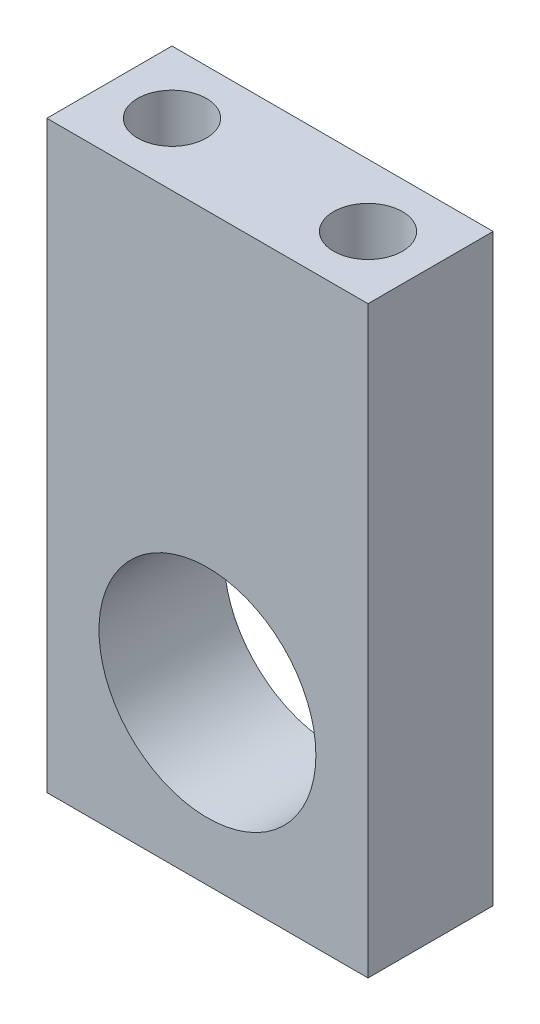
ISO-10303-21;
HEADER;
FILE_DESCRIPTION(('STEP AP214'),'2;1');
FILE_NAME('part.step','',(''),(''),'','','');
FILE_SCHEMA(('AUTOMOTIVE_DESIGN { 1 0 10303 214 1 1 1 1 }'));
ENDSEC;
DATA;
#1=APPLICATION_CONTEXT('core data for automotive mechanical design processes');
#2=APPLICATION_PROTOCOL_DEFINITION('international standard','automotive_design',2000,#1);
#3=PRODUCT_CONTEXT('',#1,'mechanical');
#4=PRODUCT('Part','Part','',(#3));
#5=PRODUCT_RELATED_PRODUCT_CATEGORY('part','',(#4));
#6=PRODUCT_DEFINITION_FORMATION('','',#4);
#7=PRODUCT_DEFINITION_CONTEXT('part definition',#1,'design');
#8=PRODUCT_DEFINITION('design','',#6,#7);
#9=PRODUCT_DEFINITION_SHAPE('','',#8);
#10=(LENGTH_UNIT() NAMED_UNIT(*) SI_UNIT(.MILLI.,.METRE.));
#11=(NAMED_UNIT(*) PLANE_ANGLE_UNIT() SI_UNIT($,.RADIAN.));
#12=(NAMED_UNIT(*) SI_UNIT($,.STERADIAN.) SOLID_ANGLE_UNIT());
#13=UNCERTAINTY_MEASURE_WITH_UNIT(LENGTH_MEASURE(1.E-05),#10,'distance_accuracy_value','');
#14=(GEOMETRIC_REPRESENTATION_CONTEXT(3) GLOBAL_UNCERTAINTY_ASSIGNED_CONTEXT((#13)) GLOBAL_UNIT_ASSIGNED_CONTEXT((#10,
#11,#12)) REPRESENTATION_CONTEXT('',''));
#15=CARTESIAN_POINT('',(0.,0.,0.));
#16=DIRECTION('',(0.,0.,1.));
#17=DIRECTION('',(1.,0.,0.));
#18=AXIS2_PLACEMENT_3D('',#15,#16,#17);
#19=CARTESIAN_POINT('',(7.7,28.,-3.));
#20=DIRECTION('',(-1.,0.,0.));
#21=DIRECTION('',(0.,0.,1.));
#22=AXIS2_PLACEMENT_3D('',#19,#20,#21);
#23=PLANE('',#22);
#24=DIRECTION('',(0.,0.,-1.));
#25=VECTOR('',#24,1.);
#26=CARTESIAN_POINT('',(7.7,0.,-3.));
#27=LINE('',#26,#25);
#28=CARTESIAN_POINT('',(7.7,0.,3.));
#29=VERTEX_POINT('',#28);
#30=CARTESIAN_POINT('',(7.7,0.,-3.));
#31=VERTEX_POINT('',#30);
#32=EDGE_CURVE('E131',#29,#31,#27,.T.);
#33=ORIENTED_EDGE('',*,*,#32,.T.);
#34=DIRECTION('',(0.,-1.,0.));
#35=VECTOR('',#34,1.);
#36=CARTESIAN_POINT('',(7.7,28.,-3.));
#37=LINE('',#36,#35);
#38=CARTESIAN_POINT('',(7.7,28.,-3.));
#39=VERTEX_POINT('',#38);
#40=EDGE_CURVE('E11',#39,#31,#37,.T.);
#41=ORIENTED_EDGE('',*,*,#40,.F.);
#42=DIRECTION('',(0.,0.,-1.));
#43=VECTOR('',#42,1.);
#44=CARTESIAN_POINT('',(7.7,28.,-3.));
#45=LINE('',#44,#43);
#46=CARTESIAN_POINT('',(7.7,28.,3.));
#47=VERTEX_POINT('',#46);
#48=EDGE_CURVE('E132',#47,#39,#45,.T.);
#49=ORIENTED_EDGE('',*,*,#48,.F.);
#50=DIRECTION('',(0.,-1.,0.));
#51=VECTOR('',#50,1.);
#52=CARTESIAN_POINT('',(7.7,28.,3.));
#53=LINE('',#52,#51);
#54=EDGE_CURVE('E138',#47,#29,#53,.T.);
#55=ORIENTED_EDGE('',*,*,#54,.T.);
#56=EDGE_LOOP('',(#33,#41,#49,#55));
#57=FACE_BOUND('',#56,.T.);
#58=ADVANCED_FACE('F32',(#57),#23,.F.);
#59=CARTESIAN_POINT('',(-7.7,28.,-3.));
#60=DIRECTION('',(0.,0.,1.));
#61=DIRECTION('',(1.,0.,0.));
#62=AXIS2_PLACEMENT_3D('',#59,#60,#61);
#63=PLANE('',#62);
#64=CARTESIAN_POINT('',(0.,8.,-3.));
#65=DIRECTION('',(0.,0.,1.));
#66=DIRECTION('',(1.,0.,0.));
#67=AXIS2_PLACEMENT_3D('',#64,#65,#66);
#68=CIRCLE('',#67,5.2);
#69=CARTESIAN_POINT('',(5.2,8.,-3.));
#70=VERTEX_POINT('',#69);
#71=EDGE_CURVE('E116',#70,#70,#68,.F.);
#72=ORIENTED_EDGE('',*,*,#71,.F.);
#73=EDGE_LOOP('',(#72));
#74=FACE_BOUND('',#73,.T.);
#75=DIRECTION('',(-1.,0.,0.));
#76=VECTOR('',#75,1.);
#77=CARTESIAN_POINT('',(-7.7,0.,-3.));
#78=LINE('',#77,#76);
#79=CARTESIAN_POINT('',(-7.7,0.,-3.));
#80=VERTEX_POINT('',#79);
#81=EDGE_CURVE('E141',#31,#80,#78,.T.);
#82=ORIENTED_EDGE('',*,*,#81,.T.);
#83=DIRECTION('',(0.,-1.,0.));
#84=VECTOR('',#83,1.);
#85=CARTESIAN_POINT('',(-7.7,28.,-3.));
#86=LINE('',#85,#84);
#87=CARTESIAN_POINT('',(-7.7,28.,-3.));
#88=VERTEX_POINT('',#87);
#89=EDGE_CURVE('E40',#88,#80,#86,.T.);
#90=ORIENTED_EDGE('',*,*,#89,.F.);
#91=DIRECTION('',(-1.,0.,0.));
#92=VECTOR('',#91,1.);
#93=CARTESIAN_POINT('',(-7.7,28.,-3.));
#94=LINE('',#93,#92);
#95=EDGE_CURVE('E79',#39,#88,#94,.T.);
#96=ORIENTED_EDGE('',*,*,#95,.F.);
#97=ORIENTED_EDGE('',*,*,#40,.T.);
#98=EDGE_LOOP('',(#82,#90,#96,#97));
#99=FACE_BOUND('',#98,.T.);
#100=ADVANCED_FACE('F166',(#74,#99),#63,.F.);
#101=CARTESIAN_POINT('',(-7.7,28.,-3.));
#102=DIRECTION('',(1.,0.,0.));
#103=DIRECTION('',(0.,0.,-1.));
#104=AXIS2_PLACEMENT_3D('',#101,#102,#103);
#105=PLANE('',#104);
#106=DIRECTION('',(0.,0.,1.));
#107=VECTOR('',#106,1.);
#108=CARTESIAN_POINT('',(-7.7,0.,-3.));
#109=LINE('',#108,#107);
#110=CARTESIAN_POINT('',(-7.7,0.,3.));
#111=VERTEX_POINT('',#110);
#112=EDGE_CURVE('E66',#80,#111,#109,.T.);
#113=ORIENTED_EDGE('',*,*,#112,.T.);
#114=DIRECTION('',(0.,-1.,0.));
#115=VECTOR('',#114,1.);
#116=CARTESIAN_POINT('',(-7.7,28.,3.));
#117=LINE('',#116,#115);
#118=CARTESIAN_POINT('',(-7.7,28.,3.));
#119=VERTEX_POINT('',#118);
#120=EDGE_CURVE('E146',#119,#111,#117,.T.);
#121=ORIENTED_EDGE('',*,*,#120,.F.);
#122=DIRECTION('',(0.,0.,1.));
#123=VECTOR('',#122,1.);
#124=CARTESIAN_POINT('',(-7.7,28.,-3.));
#125=LINE('',#124,#123);
#126=EDGE_CURVE('E135',#88,#119,#125,.T.);
#127=ORIENTED_EDGE('',*,*,#126,.F.);
#128=ORIENTED_EDGE('',*,*,#89,.T.);
#129=EDGE_LOOP('',(#113,#121,#127,#128));
#130=FACE_BOUND('',#129,.T.);
#131=ADVANCED_FACE('F148',(#130),#105,.F.);
#132=CARTESIAN_POINT('',(-7.7,28.,3.));
#133=DIRECTION('',(0.,0.,-1.));
#134=DIRECTION('',(-1.,0.,0.));
#135=AXIS2_PLACEMENT_3D('',#132,#133,#134);
#136=PLANE('',#135);
#137=CARTESIAN_POINT('',(0.,8.,3.));
#138=DIRECTION('',(0.,0.,1.));
#139=DIRECTION('',(1.,0.,0.));
#140=AXIS2_PLACEMENT_3D('',#137,#138,#139);
#141=CIRCLE('',#140,5.2);
#142=CARTESIAN_POINT('',(5.2,8.,3.));
#143=VERTEX_POINT('',#142);
#144=EDGE_CURVE('E113',#143,#143,#141,.T.);
#145=ORIENTED_EDGE('',*,*,#144,.F.);
#146=EDGE_LOOP('',(#145));
#147=FACE_BOUND('',#146,.T.);
#148=DIRECTION('',(1.,0.,0.));
#149=VECTOR('',#148,1.);
#150=CARTESIAN_POINT('',(-7.7,0.,3.));
#151=LINE('',#150,#149);
#152=EDGE_CURVE('E72',#111,#29,#151,.T.);
#153=ORIENTED_EDGE('',*,*,#152,.T.);
#154=ORIENTED_EDGE('',*,*,#54,.F.);
#155=DIRECTION('',(1.,0.,0.));
#156=VECTOR('',#155,1.);
#157=CARTESIAN_POINT('',(-7.7,28.,3.));
#158=LINE('',#157,#156);
#159=EDGE_CURVE('E48',#119,#47,#158,.T.);
#160=ORIENTED_EDGE('',*,*,#159,.F.);
#161=ORIENTED_EDGE('',*,*,#120,.T.);
#162=EDGE_LOOP('',(#153,#154,#160,#161));
#163=FACE_BOUND('',#162,.T.);
#164=ADVANCED_FACE('F155',(#147,#163),#136,.F.);
#165=CARTESIAN_POINT('',(0.,28.,0.));
#166=DIRECTION('',(0.,1.,0.));
#167=DIRECTION('',(0.,0.,1.));
#168=AXIS2_PLACEMENT_3D('',#165,#166,#167);
#169=PLANE('',#168);
#170=CARTESIAN_POINT('',(-4.7,28.,0.));
#171=DIRECTION('',(0.,1.,0.));
#172=DIRECTION('',(0.,0.,1.));
#173=AXIS2_PLACEMENT_3D('',#170,#171,#172);
#174=CIRCLE('',#173,1.64999999999999);
#175=CARTESIAN_POINT('',(-4.7,28.,1.64999999999999));
#176=VERTEX_POINT('',#175);
#177=EDGE_CURVE('E119',#176,#176,#174,.T.);
#178=ORIENTED_EDGE('',*,*,#177,.F.);
#179=EDGE_LOOP('',(#178));
#180=FACE_BOUND('',#179,.T.);
#181=CARTESIAN_POINT('',(4.7,28.,0.));
#182=DIRECTION('',(0.,1.,0.));
#183=DIRECTION('',(0.,0.,1.));
#184=AXIS2_PLACEMENT_3D('',#181,#182,#183);
#185=CIRCLE('',#184,1.64999999999999);
#186=CARTESIAN_POINT('',(4.7,28.,1.64999999999999));
#187=VERTEX_POINT('',#186);
#188=EDGE_CURVE('E125',#187,#187,#185,.T.);
#189=ORIENTED_EDGE('',*,*,#188,.F.);
#190=EDGE_LOOP('',(#189));
#191=FACE_BOUND('',#190,.T.);
#192=ORIENTED_EDGE('',*,*,#48,.T.);
#193=ORIENTED_EDGE('',*,*,#95,.T.);
#194=ORIENTED_EDGE('',*,*,#126,.T.);
#195=ORIENTED_EDGE('',*,*,#159,.T.);
#196=EDGE_LOOP('',(#192,#193,#194,#195));
#197=FACE_BOUND('',#196,.T.);
#198=ADVANCED_FACE('F157',(#180,#191,#197),#169,.T.);
#199=CARTESIAN_POINT('',(0.,0.,0.));
#200=DIRECTION('',(0.,1.,0.));
#201=DIRECTION('',(0.,0.,1.));
#202=AXIS2_PLACEMENT_3D('',#199,#200,#201);
#203=PLANE('',#202);
#204=CARTESIAN_POINT('',(4.7,0.,0.));
#205=DIRECTION('',(0.,-1.,0.));
#206=DIRECTION('',(0.,0.,-1.));
#207=AXIS2_PLACEMENT_3D('',#204,#205,#206);
#208=CIRCLE('',#207,1.64999999999999);
#209=CARTESIAN_POINT('',(4.7,0.,-1.64999999999999));
#210=VERTEX_POINT('',#209);
#211=EDGE_CURVE('E103',#210,#210,#208,.T.);
#212=ORIENTED_EDGE('',*,*,#211,.F.);
#213=EDGE_LOOP('',(#212));
#214=FACE_BOUND('',#213,.T.);
#215=CARTESIAN_POINT('',(-4.7,0.,0.));
#216=DIRECTION('',(0.,-1.,0.));
#217=DIRECTION('',(0.,0.,-1.));
#218=AXIS2_PLACEMENT_3D('',#215,#216,#217);
#219=CIRCLE('',#218,1.64999999999999);
#220=CARTESIAN_POINT('',(-4.7,0.,-1.64999999999999));
#221=VERTEX_POINT('',#220);
#222=EDGE_CURVE('E102',#221,#221,#219,.T.);
#223=ORIENTED_EDGE('',*,*,#222,.F.);
#224=EDGE_LOOP('',(#223));
#225=FACE_BOUND('',#224,.T.);
#226=ORIENTED_EDGE('',*,*,#32,.F.);
#227=ORIENTED_EDGE('',*,*,#152,.F.);
#228=ORIENTED_EDGE('',*,*,#112,.F.);
#229=ORIENTED_EDGE('',*,*,#81,.F.);
#230=EDGE_LOOP('',(#226,#227,#228,#229));
#231=FACE_BOUND('',#230,.T.);
#232=ADVANCED_FACE('F151',(#214,#225,#231),#203,.F.);
#233=CARTESIAN_POINT('',(4.7,14.6,0.));
#234=DIRECTION('',(0.,1.,0.));
#235=DIRECTION('',(0.,0.,1.));
#236=AXIS2_PLACEMENT_3D('',#233,#234,#235);
#237=CONICAL_SURFACE('',#236,1.65,1.02974425867665);
#238=CARTESIAN_POINT('',(4.7,13.6085799786045,0.));
#239=VERTEX_POINT('',#238);
#240=VERTEX_LOOP('',#239);
#241=FACE_BOUND('',#240,.T.);
#242=CARTESIAN_POINT('',(4.7,14.6,0.));
#243=DIRECTION('',(0.,1.,0.));
#244=DIRECTION('',(0.,0.,1.));
#245=AXIS2_PLACEMENT_3D('',#242,#243,#244);
#246=CIRCLE('',#245,1.65);
#247=CARTESIAN_POINT('',(4.7,14.6,1.65));
#248=VERTEX_POINT('',#247);
#249=EDGE_CURVE('E128',#248,#248,#246,.T.);
#250=ORIENTED_EDGE('',*,*,#249,.T.);
#251=EDGE_LOOP('',(#250));
#252=FACE_BOUND('',#251,.T.);
#253=ADVANCED_FACE('F202',(#241,#252),#237,.F.);
#254=CARTESIAN_POINT('',(4.7,28.,0.));
#255=DIRECTION('',(0.,1.,0.));
#256=DIRECTION('',(0.,0.,1.));
#257=AXIS2_PLACEMENT_3D('',#254,#255,#256);
#258=CYLINDRICAL_SURFACE('',#257,1.64999999999999);
#259=ORIENTED_EDGE('',*,*,#249,.F.);
#260=EDGE_LOOP('',(#259));
#261=FACE_BOUND('',#260,.T.);
#262=ORIENTED_EDGE('',*,*,#188,.T.);
#263=EDGE_LOOP('',(#262));
#264=FACE_BOUND('',#263,.T.);
#265=ADVANCED_FACE('F198',(#261,#264),#258,.F.);
#266=CARTESIAN_POINT('',(-4.7,14.6,0.));
#267=DIRECTION('',(0.,1.,0.));
#268=DIRECTION('',(0.,0.,1.));
#269=AXIS2_PLACEMENT_3D('',#266,#267,#268);
#270=CONICAL_SURFACE('',#269,1.64999999999999,1.02974425867665);
#271=CARTESIAN_POINT('',(-4.7,13.6085799786045,0.));
#272=VERTEX_POINT('',#271);
#273=VERTEX_LOOP('',#272);
#274=FACE_BOUND('',#273,.T.);
#275=CARTESIAN_POINT('',(-4.7,14.6,0.));
#276=DIRECTION('',(0.,1.,0.));
#277=DIRECTION('',(0.,0.,1.));
#278=AXIS2_PLACEMENT_3D('',#275,#276,#277);
#279=CIRCLE('',#278,1.64999999999999);
#280=CARTESIAN_POINT('',(-4.7,14.6,1.65));
#281=VERTEX_POINT('',#280);
#282=EDGE_CURVE('E122',#281,#281,#279,.T.);
#283=ORIENTED_EDGE('',*,*,#282,.T.);
#284=EDGE_LOOP('',(#283));
#285=FACE_BOUND('',#284,.T.);
#286=ADVANCED_FACE('F191',(#274,#285),#270,.F.);
#287=CARTESIAN_POINT('',(-4.7,28.,0.));
#288=DIRECTION('',(0.,1.,0.));
#289=DIRECTION('',(0.,0.,1.));
#290=AXIS2_PLACEMENT_3D('',#287,#288,#289);
#291=CYLINDRICAL_SURFACE('',#290,1.64999999999999);
#292=ORIENTED_EDGE('',*,*,#282,.F.);
#293=EDGE_LOOP('',(#292));
#294=FACE_BOUND('',#293,.T.);
#295=ORIENTED_EDGE('',*,*,#177,.T.);
#296=EDGE_LOOP('',(#295));
#297=FACE_BOUND('',#296,.T.);
#298=ADVANCED_FACE('F182',(#294,#297),#291,.F.);
#299=CARTESIAN_POINT('',(0.,8.,-3.001));
#300=DIRECTION('',(0.,0.,1.));
#301=DIRECTION('',(1.,0.,0.));
#302=AXIS2_PLACEMENT_3D('',#299,#300,#301);
#303=CYLINDRICAL_SURFACE('',#302,5.2);
#304=CARTESIAN_POINT('',(5.2,8.,3.));
#305=CARTESIAN_POINT('',(5.2,8.,2.9375));
#306=CARTESIAN_POINT('',(5.2,8.,2.875));
#307=CARTESIAN_POINT('',(5.2,8.,2.75));
#308=CARTESIAN_POINT('',(5.2,8.,2.6875));
#309=CARTESIAN_POINT('',(5.2,8.,2.5625));
#310=CARTESIAN_POINT('',(5.2,8.,2.5));
#311=CARTESIAN_POINT('',(5.2,8.,2.375));
#312=CARTESIAN_POINT('',(5.2,8.,2.3125));
#313=CARTESIAN_POINT('',(5.2,8.,2.1875));
#314=CARTESIAN_POINT('',(5.2,8.,2.125));
#315=CARTESIAN_POINT('',(5.2,8.,2.));
#316=CARTESIAN_POINT('',(5.2,8.,1.9375));
#317=CARTESIAN_POINT('',(5.2,8.,1.8125));
#318=CARTESIAN_POINT('',(5.2,8.,1.75));
#319=CARTESIAN_POINT('',(5.2,8.,1.625));
#320=CARTESIAN_POINT('',(5.2,8.,1.5625));
#321=CARTESIAN_POINT('',(5.2,8.,1.4375));
#322=CARTESIAN_POINT('',(5.2,8.,1.375));
#323=CARTESIAN_POINT('',(5.2,8.,1.25));
#324=CARTESIAN_POINT('',(5.2,8.,1.1875));
#325=CARTESIAN_POINT('',(5.2,8.,1.0625));
#326=CARTESIAN_POINT('',(5.2,8.,1.));
#327=CARTESIAN_POINT('',(5.2,8.,0.875));
#328=CARTESIAN_POINT('',(5.2,8.,0.8125));
#329=CARTESIAN_POINT('',(5.2,8.,0.6875));
#330=CARTESIAN_POINT('',(5.2,8.,0.625));
#331=CARTESIAN_POINT('',(5.2,8.,0.5));
#332=CARTESIAN_POINT('',(5.2,8.,0.4375));
#333=CARTESIAN_POINT('',(5.2,8.,0.3125));
#334=CARTESIAN_POINT('',(5.2,8.,0.25));
#335=CARTESIAN_POINT('',(5.2,8.,0.125));
#336=CARTESIAN_POINT('',(5.2,8.,0.0624999999999996));
#337=CARTESIAN_POINT('',(5.2,8.,-0.0625000000000005));
#338=CARTESIAN_POINT('',(5.2,8.,-0.125000000000001));
#339=CARTESIAN_POINT('',(5.2,8.,-0.250000000000001));
#340=CARTESIAN_POINT('',(5.2,8.,-0.3125));
#341=CARTESIAN_POINT('',(5.2,8.,-0.4375));
#342=CARTESIAN_POINT('',(5.2,8.,-0.5));
#343=CARTESIAN_POINT('',(5.2,8.,-0.625000000000001));
#344=CARTESIAN_POINT('',(5.2,8.,-0.687500000000001));
#345=CARTESIAN_POINT('',(5.2,8.,-0.812500000000001));
#346=CARTESIAN_POINT('',(5.2,8.,-0.875000000000001));
#347=CARTESIAN_POINT('',(5.2,8.,-1.));
#348=CARTESIAN_POINT('',(5.2,8.,-1.0625));
#349=CARTESIAN_POINT('',(5.2,8.,-1.1875));
#350=CARTESIAN_POINT('',(5.2,8.,-1.25));
#351=CARTESIAN_POINT('',(5.2,8.,-1.375));
#352=CARTESIAN_POINT('',(5.2,8.,-1.4375));
#353=CARTESIAN_POINT('',(5.2,8.,-1.5625));
#354=CARTESIAN_POINT('',(5.2,8.,-1.625));
#355=CARTESIAN_POINT('',(5.2,8.,-1.75));
#356=CARTESIAN_POINT('',(5.2,8.,-1.8125));
#357=CARTESIAN_POINT('',(5.2,8.,-1.9375));
#358=CARTESIAN_POINT('',(5.2,8.,-2.));
#359=CARTESIAN_POINT('',(5.2,8.,-2.125));
#360=CARTESIAN_POINT('',(5.2,8.,-2.1875));
#361=CARTESIAN_POINT('',(5.2,8.,-2.3125));
#362=CARTESIAN_POINT('',(5.2,8.,-2.375));
#363=CARTESIAN_POINT('',(5.2,8.,-2.5));
#364=CARTESIAN_POINT('',(5.2,8.,-2.5625));
#365=CARTESIAN_POINT('',(5.2,8.,-2.6875));
#366=CARTESIAN_POINT('',(5.2,8.,-2.75));
#367=CARTESIAN_POINT('',(5.2,8.,-2.875));
#368=CARTESIAN_POINT('',(5.2,8.,-2.9375));
#369=CARTESIAN_POINT('',(5.2,8.,-3.));
#370=B_SPLINE_CURVE_WITH_KNOTS('',3,(#304,#305,#306,#307,#308,#309,#310,#311,#312,#313,#314,
#315,#316,#317,#318,#319,#320,#321,#322,#323,#324,#325,#326,#327,#328,#329,#330,#331,#332,#333,
#334,#335,#336,#337,#338,#339,#340,#341,#342,#343,#344,#345,#346,#347,#348,#349,#350,#351,#352,
#353,#354,#355,#356,#357,#358,#359,#360,#361,#362,#363,#364,#365,#366,#367,#368,#369),
.UNSPECIFIED.,.F.,.F.,(4,2,2,2,2,2,2,2,2,2,2,2,2,2,2,2,2,2,2,2,2,2,2,2,2,2,2,2,2,2,2,2,4),(0.,
0.1875,0.375,0.5625,0.75,0.9375,1.125,1.3125,1.5,1.6875,1.875,2.0625,2.25,2.4375,2.625,2.8125,
3.,3.1875,3.375,3.5625,3.75,3.9375,4.125,4.3125,4.5,4.6875,4.875,5.0625,5.25,5.4375,5.625,
5.8125,6.),.UNSPECIFIED.);
#371=EDGE_CURVE('BSEAM179',#143,#70,#370,.T.);
#372=ORIENTED_EDGE('',*,*,#144,.T.);
#373=ORIENTED_EDGE('',*,*,#71,.T.);
#374=ORIENTED_EDGE('',*,*,#371,.T.);
#375=ORIENTED_EDGE('',*,*,#371,.F.);
#376=EDGE_LOOP('',(#372,#374,#373,#375));
#377=FACE_BOUND('',#376,.T.);
#378=ADVANCED_FACE('F179',(#377),#303,.F.);
#379=CARTESIAN_POINT('',(-4.7,3.,0.));
#380=DIRECTION('',(0.,-1.,0.));
#381=DIRECTION('',(0.,0.,-1.));
#382=AXIS2_PLACEMENT_3D('',#379,#380,#381);
#383=CONICAL_SURFACE('',#382,1.65,1.02974425867665);
#384=CARTESIAN_POINT('',(-4.7,3.99142002139548,0.));
#385=VERTEX_POINT('',#384);
#386=VERTEX_LOOP('',#385);
#387=FACE_BOUND('',#386,.T.);
#388=CARTESIAN_POINT('',(-4.7,3.,0.));
#389=DIRECTION('',(0.,-1.,0.));
#390=DIRECTION('',(0.,0.,-1.));
#391=AXIS2_PLACEMENT_3D('',#388,#389,#390);
#392=CIRCLE('',#391,1.65);
#393=CARTESIAN_POINT('',(-4.7,3.,-1.65));
#394=VERTEX_POINT('',#393);
#395=EDGE_CURVE('E106',#394,#394,#392,.T.);
#396=ORIENTED_EDGE('',*,*,#395,.T.);
#397=EDGE_LOOP('',(#396));
#398=FACE_BOUND('',#397,.T.);
#399=ADVANCED_FACE('F181',(#387,#398),#383,.F.);
#400=CARTESIAN_POINT('',(-4.7,0.,0.));
#401=DIRECTION('',(0.,-1.,0.));
#402=DIRECTION('',(0.,0.,-1.));
#403=AXIS2_PLACEMENT_3D('',#400,#401,#402);
#404=CYLINDRICAL_SURFACE('',#403,1.64999999999999);
#405=ORIENTED_EDGE('',*,*,#395,.F.);
#406=EDGE_LOOP('',(#405));
#407=FACE_BOUND('',#406,.T.);
#408=ORIENTED_EDGE('',*,*,#222,.T.);
#409=EDGE_LOOP('',(#408));
#410=FACE_BOUND('',#409,.T.);
#411=ADVANCED_FACE('F96',(#407,#410),#404,.F.);
#412=CARTESIAN_POINT('',(4.7,3.,0.));
#413=DIRECTION('',(0.,-1.,0.));
#414=DIRECTION('',(0.,0.,-1.));
#415=AXIS2_PLACEMENT_3D('',#412,#413,#414);
#416=CONICAL_SURFACE('',#415,1.65,1.02974425867665);
#417=CARTESIAN_POINT('',(4.7,3.99142002139548,0.));
#418=VERTEX_POINT('',#417);
#419=VERTEX_LOOP('',#418);
#420=FACE_BOUND('',#419,.T.);
#421=CARTESIAN_POINT('',(4.7,3.,0.));
#422=DIRECTION('',(0.,-1.,0.));
#423=DIRECTION('',(0.,0.,-1.));
#424=AXIS2_PLACEMENT_3D('',#421,#422,#423);
#425=CIRCLE('',#424,1.65);
#426=CARTESIAN_POINT('',(4.7,3.,-1.65));
#427=VERTEX_POINT('',#426);
#428=EDGE_CURVE('E100',#427,#427,#425,.T.);
#429=ORIENTED_EDGE('',*,*,#428,.T.);
#430=EDGE_LOOP('',(#429));
#431=FACE_BOUND('',#430,.T.);
#432=ADVANCED_FACE('F92',(#420,#431),#416,.F.);
#433=CARTESIAN_POINT('',(4.7,0.,0.));
#434=DIRECTION('',(0.,-1.,0.));
#435=DIRECTION('',(0.,0.,-1.));
#436=AXIS2_PLACEMENT_3D('',#433,#434,#435);
#437=CYLINDRICAL_SURFACE('',#436,1.64999999999999);
#438=ORIENTED_EDGE('',*,*,#428,.F.);
#439=EDGE_LOOP('',(#438));
#440=FACE_BOUND('',#439,.T.);
#441=ORIENTED_EDGE('',*,*,#211,.T.);
#442=EDGE_LOOP('',(#441));
#443=FACE_BOUND('',#442,.T.);
#444=ADVANCED_FACE('F95',(#440,#443),#437,.F.);
#445=CLOSED_SHELL('',(#58,#100,#131,#164,#198,#232,#253,#265,#286,#298,#378,#399,#411,#432,#444));
#446=MANIFOLD_SOLID_BREP('B2',#445);
#447=ADVANCED_BREP_SHAPE_REPRESENTATION('',(#18,#446),#14);
#448=SHAPE_DEFINITION_REPRESENTATION(#9,#447);
ENDSEC;
END-ISO-10303-21;
